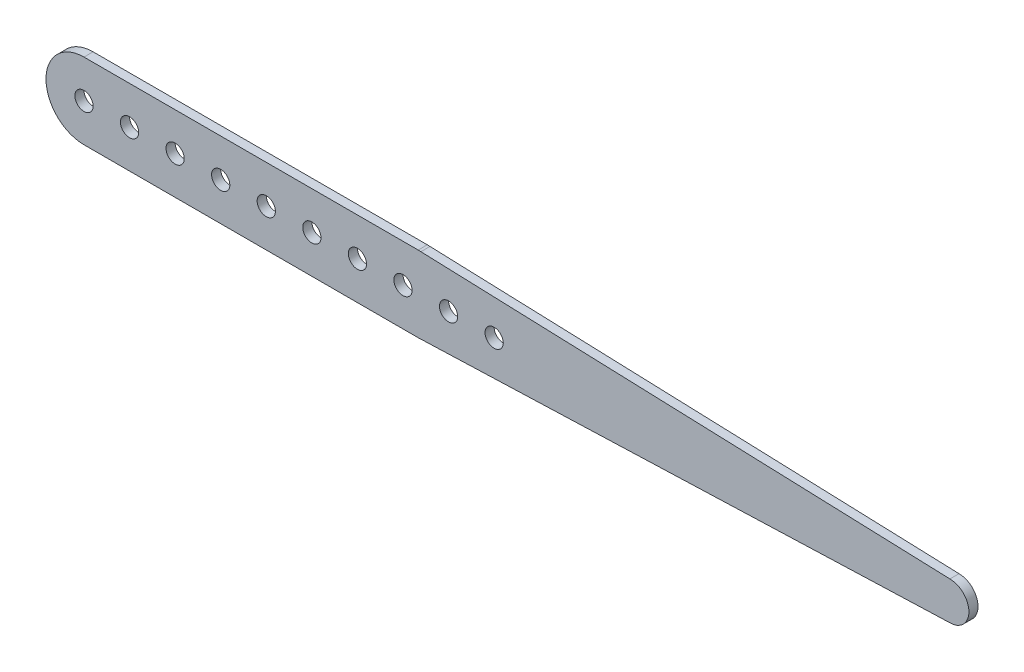
ISO-10303-21;
HEADER;
FILE_DESCRIPTION(('STEP AP214'),'2;1');
FILE_NAME('part.step','',(''),(''),'','','');
FILE_SCHEMA(('AUTOMOTIVE_DESIGN { 1 0 10303 214 1 1 1 1 }'));
ENDSEC;
DATA;
#1=APPLICATION_CONTEXT('core data for automotive mechanical design processes');
#2=APPLICATION_PROTOCOL_DEFINITION('international standard','automotive_design',2000,#1);
#3=PRODUCT_CONTEXT('',#1,'mechanical');
#4=PRODUCT('Part','Part','',(#3));
#5=PRODUCT_RELATED_PRODUCT_CATEGORY('part','',(#4));
#6=PRODUCT_DEFINITION_FORMATION('','',#4);
#7=PRODUCT_DEFINITION_CONTEXT('part definition',#1,'design');
#8=PRODUCT_DEFINITION('design','',#6,#7);
#9=PRODUCT_DEFINITION_SHAPE('','',#8);
#10=(LENGTH_UNIT() NAMED_UNIT(*) SI_UNIT(.MILLI.,.METRE.));
#11=(NAMED_UNIT(*) PLANE_ANGLE_UNIT() SI_UNIT($,.RADIAN.));
#12=(NAMED_UNIT(*) SI_UNIT($,.STERADIAN.) SOLID_ANGLE_UNIT());
#13=UNCERTAINTY_MEASURE_WITH_UNIT(LENGTH_MEASURE(1.E-05),#10,'distance_accuracy_value','');
#14=(GEOMETRIC_REPRESENTATION_CONTEXT(3) GLOBAL_UNCERTAINTY_ASSIGNED_CONTEXT((#13)) GLOBAL_UNIT_ASSIGNED_CONTEXT((#10,
#11,#12)) REPRESENTATION_CONTEXT('',''));
#15=CARTESIAN_POINT('',(0.,0.,0.));
#16=DIRECTION('',(0.,0.,1.));
#17=DIRECTION('',(1.,0.,0.));
#18=AXIS2_PLACEMENT_3D('',#15,#16,#17);
#19=CARTESIAN_POINT('',(0.,-12.5,3.));
#20=DIRECTION('',(0.,1.,0.));
#21=DIRECTION('',(-1.,0.,0.));
#22=AXIS2_PLACEMENT_3D('',#19,#20,#21);
#23=PLANE('',#22);
#24=DIRECTION('',(1.,0.,0.));
#25=VECTOR('',#24,1.);
#26=CARTESIAN_POINT('',(0.,-12.5,0.));
#27=LINE('',#26,#25);
#28=CARTESIAN_POINT('',(65.,-12.5,0.));
#29=VERTEX_POINT('',#28);
#30=CARTESIAN_POINT('',(175.,-12.5,0.));
#31=VERTEX_POINT('',#30);
#32=EDGE_CURVE('E238',#29,#31,#27,.T.);
#33=ORIENTED_EDGE('',*,*,#32,.T.);
#34=DIRECTION('',(0.,0.,-1.));
#35=VECTOR('',#34,1.);
#36=CARTESIAN_POINT('',(175.,-12.5,3.));
#37=LINE('',#36,#35);
#38=CARTESIAN_POINT('',(175.,-12.5,3.));
#39=VERTEX_POINT('',#38);
#40=EDGE_CURVE('E12',#39,#31,#37,.T.);
#41=ORIENTED_EDGE('',*,*,#40,.F.);
#42=DIRECTION('',(1.,0.,0.));
#43=VECTOR('',#42,1.);
#44=CARTESIAN_POINT('',(0.,-12.5,3.));
#45=LINE('',#44,#43);
#46=CARTESIAN_POINT('',(65.,-12.5,3.));
#47=VERTEX_POINT('',#46);
#48=EDGE_CURVE('E157',#47,#39,#45,.T.);
#49=ORIENTED_EDGE('',*,*,#48,.F.);
#50=DIRECTION('',(0.,0.,-1.));
#51=VECTOR('',#50,1.);
#52=CARTESIAN_POINT('',(65.,-12.5,3.));
#53=LINE('',#52,#51);
#54=EDGE_CURVE('E131',#47,#29,#53,.T.);
#55=ORIENTED_EDGE('',*,*,#54,.T.);
#56=EDGE_LOOP('',(#33,#41,#49,#55));
#57=FACE_BOUND('',#56,.T.);
#58=ADVANCED_FACE('F39',(#57),#23,.F.);
#59=CARTESIAN_POINT('',(175.,0.,3.));
#60=DIRECTION('',(0.,0.,-1.));
#61=DIRECTION('',(-1.,0.,0.));
#62=AXIS2_PLACEMENT_3D('',#59,#60,#61);
#63=CYLINDRICAL_SURFACE('',#62,12.5);
#64=CARTESIAN_POINT('',(175.,0.,0.));
#65=DIRECTION('',(0.,0.,1.));
#66=DIRECTION('',(1.,0.,0.));
#67=AXIS2_PLACEMENT_3D('',#64,#65,#66);
#68=CIRCLE('',#67,12.5);
#69=CARTESIAN_POINT('',(175.891719745223,-12.468152866242,0.));
#70=VERTEX_POINT('',#69);
#71=EDGE_CURVE('E241',#31,#70,#68,.T.);
#72=ORIENTED_EDGE('',*,*,#71,.T.);
#73=DIRECTION('',(0.,0.,-1.));
#74=VECTOR('',#73,1.);
#75=CARTESIAN_POINT('',(175.891719745223,-12.468152866242,3.));
#76=LINE('',#75,#74);
#77=CARTESIAN_POINT('',(175.891719745223,-12.468152866242,3.));
#78=VERTEX_POINT('',#77);
#79=EDGE_CURVE('E48',#78,#70,#76,.T.);
#80=ORIENTED_EDGE('',*,*,#79,.F.);
#81=CARTESIAN_POINT('',(175.,0.,3.));
#82=DIRECTION('',(0.,0.,1.));
#83=DIRECTION('',(1.,0.,0.));
#84=AXIS2_PLACEMENT_3D('',#81,#82,#83);
#85=CIRCLE('',#84,12.5);
#86=EDGE_CURVE('E99',#39,#78,#85,.T.);
#87=ORIENTED_EDGE('',*,*,#86,.F.);
#88=ORIENTED_EDGE('',*,*,#40,.T.);
#89=EDGE_LOOP('',(#72,#80,#87,#88));
#90=FACE_BOUND('',#89,.T.);
#91=ADVANCED_FACE('F266',(#90),#63,.T.);
#92=CARTESIAN_POINT('',(0.668789808917198,-18.7261146496815,3.));
#93=DIRECTION('',(0.0356915305124125,-0.999362854347549,0.));
#94=DIRECTION('',(0.99936285434755,0.0356915305124125,0.));
#95=AXIS2_PLACEMENT_3D('',#92,#93,#94);
#96=PLANE('',#95);
#97=DIRECTION('',(-0.99936285434755,-0.0356915305124125,0.));
#98=VECTOR('',#97,1.);
#99=CARTESIAN_POINT('',(0.668789808917198,-18.7261146496815,0.));
#100=LINE('',#99,#98);
#101=CARTESIAN_POINT('',(350.,-6.25,0.));
#102=VERTEX_POINT('',#101);
#103=EDGE_CURVE('E244',#102,#70,#100,.T.);
#104=ORIENTED_EDGE('',*,*,#103,.F.);
#105=DIRECTION('',(0.,0.,-1.));
#106=VECTOR('',#105,1.);
#107=CARTESIAN_POINT('',(350.,-6.25,3.));
#108=LINE('',#107,#106);
#109=CARTESIAN_POINT('',(350.,-6.25,3.));
#110=VERTEX_POINT('',#109);
#111=EDGE_CURVE('E261',#110,#102,#108,.T.);
#112=ORIENTED_EDGE('',*,*,#111,.F.);
#113=DIRECTION('',(-0.99936285434755,-0.0356915305124125,0.));
#114=VECTOR('',#113,1.);
#115=CARTESIAN_POINT('',(0.668789808917198,-18.7261146496815,3.));
#116=LINE('',#115,#114);
#117=EDGE_CURVE('E146',#110,#78,#116,.T.);
#118=ORIENTED_EDGE('',*,*,#117,.T.);
#119=ORIENTED_EDGE('',*,*,#79,.T.);
#120=EDGE_LOOP('',(#104,#112,#118,#119));
#121=FACE_BOUND('',#120,.T.);
#122=ADVANCED_FACE('F264',(#121),#96,.T.);
#123=CARTESIAN_POINT('',(350.,0.,3.));
#124=DIRECTION('',(0.,0.,-1.));
#125=DIRECTION('',(-1.,0.,0.));
#126=AXIS2_PLACEMENT_3D('',#123,#124,#125);
#127=CYLINDRICAL_SURFACE('',#126,6.25);
#128=CARTESIAN_POINT('',(350.,0.,0.));
#129=DIRECTION('',(0.,0.,1.));
#130=DIRECTION('',(1.,0.,0.));
#131=AXIS2_PLACEMENT_3D('',#128,#129,#130);
#132=CIRCLE('',#131,6.25);
#133=CARTESIAN_POINT('',(350.,6.25,0.));
#134=VERTEX_POINT('',#133);
#135=EDGE_CURVE('E247',#102,#134,#132,.T.);
#136=ORIENTED_EDGE('',*,*,#135,.T.);
#137=DIRECTION('',(0.,0.,-1.));
#138=VECTOR('',#137,1.);
#139=CARTESIAN_POINT('',(350.,6.25,3.));
#140=LINE('',#139,#138);
#141=CARTESIAN_POINT('',(350.,6.25,3.));
#142=VERTEX_POINT('',#141);
#143=EDGE_CURVE('E259',#142,#134,#140,.T.);
#144=ORIENTED_EDGE('',*,*,#143,.F.);
#145=CARTESIAN_POINT('',(350.,0.,3.));
#146=DIRECTION('',(0.,0.,1.));
#147=DIRECTION('',(1.,0.,0.));
#148=AXIS2_PLACEMENT_3D('',#145,#146,#147);
#149=CIRCLE('',#148,6.25);
#150=EDGE_CURVE('E143',#110,#142,#149,.T.);
#151=ORIENTED_EDGE('',*,*,#150,.F.);
#152=ORIENTED_EDGE('',*,*,#111,.T.);
#153=EDGE_LOOP('',(#136,#144,#151,#152));
#154=FACE_BOUND('',#153,.T.);
#155=ADVANCED_FACE('F275',(#154),#127,.T.);
#156=CARTESIAN_POINT('',(0.668789808917198,18.7261146496815,3.));
#157=DIRECTION('',(0.0356915305124125,0.999362854347549,0.));
#158=DIRECTION('',(-0.99936285434755,0.0356915305124125,0.));
#159=AXIS2_PLACEMENT_3D('',#156,#157,#158);
#160=PLANE('',#159);
#161=DIRECTION('',(0.99936285434755,-0.0356915305124125,0.));
#162=VECTOR('',#161,1.);
#163=CARTESIAN_POINT('',(0.668789808917198,18.7261146496815,0.));
#164=LINE('',#163,#162);
#165=CARTESIAN_POINT('',(175.891719745223,12.468152866242,0.));
#166=VERTEX_POINT('',#165);
#167=EDGE_CURVE('E250',#166,#134,#164,.T.);
#168=ORIENTED_EDGE('',*,*,#167,.F.);
#169=DIRECTION('',(0.,0.,-1.));
#170=VECTOR('',#169,1.);
#171=CARTESIAN_POINT('',(175.891719745223,12.468152866242,3.));
#172=LINE('',#171,#170);
#173=CARTESIAN_POINT('',(175.891719745223,12.468152866242,3.));
#174=VERTEX_POINT('',#173);
#175=EDGE_CURVE('E126',#174,#166,#172,.T.);
#176=ORIENTED_EDGE('',*,*,#175,.F.);
#177=DIRECTION('',(0.99936285434755,-0.0356915305124125,0.));
#178=VECTOR('',#177,1.);
#179=CARTESIAN_POINT('',(0.668789808917198,18.7261146496815,3.));
#180=LINE('',#179,#178);
#181=EDGE_CURVE('E119',#174,#142,#180,.T.);
#182=ORIENTED_EDGE('',*,*,#181,.T.);
#183=ORIENTED_EDGE('',*,*,#143,.T.);
#184=EDGE_LOOP('',(#168,#176,#182,#183));
#185=FACE_BOUND('',#184,.T.);
#186=ADVANCED_FACE('F280',(#185),#160,.T.);
#187=CARTESIAN_POINT('',(175.,0.,3.));
#188=DIRECTION('',(0.,0.,-1.));
#189=DIRECTION('',(-1.,0.,0.));
#190=AXIS2_PLACEMENT_3D('',#187,#188,#189);
#191=CYLINDRICAL_SURFACE('',#190,12.5);
#192=CARTESIAN_POINT('',(175.,0.,0.));
#193=DIRECTION('',(0.,0.,1.));
#194=DIRECTION('',(1.,0.,0.));
#195=AXIS2_PLACEMENT_3D('',#192,#193,#194);
#196=CIRCLE('',#195,12.5);
#197=CARTESIAN_POINT('',(175.,12.5,0.));
#198=VERTEX_POINT('',#197);
#199=EDGE_CURVE('E125',#166,#198,#196,.T.);
#200=ORIENTED_EDGE('',*,*,#199,.T.);
#201=DIRECTION('',(0.,0.,-1.));
#202=VECTOR('',#201,1.);
#203=CARTESIAN_POINT('',(175.,12.5,3.));
#204=LINE('',#203,#202);
#205=CARTESIAN_POINT('',(175.,12.5,3.));
#206=VERTEX_POINT('',#205);
#207=EDGE_CURVE('E122',#206,#198,#204,.T.);
#208=ORIENTED_EDGE('',*,*,#207,.F.);
#209=CARTESIAN_POINT('',(175.,0.,3.));
#210=DIRECTION('',(0.,0.,1.));
#211=DIRECTION('',(1.,0.,0.));
#212=AXIS2_PLACEMENT_3D('',#209,#210,#211);
#213=CIRCLE('',#212,12.5);
#214=EDGE_CURVE('E113',#174,#206,#213,.T.);
#215=ORIENTED_EDGE('',*,*,#214,.F.);
#216=ORIENTED_EDGE('',*,*,#175,.T.);
#217=EDGE_LOOP('',(#200,#208,#215,#216));
#218=FACE_BOUND('',#217,.T.);
#219=ADVANCED_FACE('F123',(#218),#191,.T.);
#220=CARTESIAN_POINT('',(0.,12.5,3.));
#221=DIRECTION('',(0.,-1.,0.));
#222=DIRECTION('',(1.,0.,0.));
#223=AXIS2_PLACEMENT_3D('',#220,#221,#222);
#224=PLANE('',#223);
#225=DIRECTION('',(-1.,0.,0.));
#226=VECTOR('',#225,1.);
#227=CARTESIAN_POINT('',(0.,12.5,0.));
#228=LINE('',#227,#226);
#229=CARTESIAN_POINT('',(65.,12.5,0.));
#230=VERTEX_POINT('',#229);
#231=EDGE_CURVE('E85',#198,#230,#228,.T.);
#232=ORIENTED_EDGE('',*,*,#231,.T.);
#233=DIRECTION('',(0.,0.,-1.));
#234=VECTOR('',#233,1.);
#235=CARTESIAN_POINT('',(65.,12.5,3.));
#236=LINE('',#235,#234);
#237=CARTESIAN_POINT('',(65.,12.5,3.));
#238=VERTEX_POINT('',#237);
#239=EDGE_CURVE('E127',#238,#230,#236,.T.);
#240=ORIENTED_EDGE('',*,*,#239,.F.);
#241=DIRECTION('',(-1.,0.,0.));
#242=VECTOR('',#241,1.);
#243=CARTESIAN_POINT('',(0.,12.5,3.));
#244=LINE('',#243,#242);
#245=EDGE_CURVE('E117',#206,#238,#244,.T.);
#246=ORIENTED_EDGE('',*,*,#245,.F.);
#247=ORIENTED_EDGE('',*,*,#207,.T.);
#248=EDGE_LOOP('',(#232,#240,#246,#247));
#249=FACE_BOUND('',#248,.T.);
#250=ADVANCED_FACE('F129',(#249),#224,.F.);
#251=CARTESIAN_POINT('',(65.,0.,3.));
#252=DIRECTION('',(0.,0.,-1.));
#253=DIRECTION('',(-1.,0.,0.));
#254=AXIS2_PLACEMENT_3D('',#251,#252,#253);
#255=CYLINDRICAL_SURFACE('',#254,2.99999999999999);
#256=CARTESIAN_POINT('',(65.,0.,3.));
#257=DIRECTION('',(0.,0.,1.));
#258=DIRECTION('',(1.,0.,0.));
#259=AXIS2_PLACEMENT_3D('',#256,#257,#258);
#260=CIRCLE('',#259,2.99999999999999);
#261=CARTESIAN_POINT('',(68.,0.,3.));
#262=VERTEX_POINT('',#261);
#263=EDGE_CURVE('E159',#262,#262,#260,.T.);
#264=ORIENTED_EDGE('',*,*,#263,.T.);
#265=EDGE_LOOP('',(#264));
#266=FACE_BOUND('',#265,.T.);
#267=CARTESIAN_POINT('',(65.,0.,0.));
#268=DIRECTION('',(0.,0.,1.));
#269=DIRECTION('',(1.,0.,0.));
#270=AXIS2_PLACEMENT_3D('',#267,#268,#269);
#271=CIRCLE('',#270,2.99999999999999);
#272=CARTESIAN_POINT('',(68.,0.,0.));
#273=VERTEX_POINT('',#272);
#274=EDGE_CURVE('E235',#273,#273,#271,.T.);
#275=ORIENTED_EDGE('',*,*,#274,.F.);
#276=EDGE_LOOP('',(#275));
#277=FACE_BOUND('',#276,.T.);
#278=ADVANCED_FACE('F297',(#266,#277),#255,.F.);
#279=CARTESIAN_POINT('',(80.,0.,3.));
#280=DIRECTION('',(0.,0.,-1.));
#281=DIRECTION('',(-1.,0.,0.));
#282=AXIS2_PLACEMENT_3D('',#279,#280,#281);
#283=CYLINDRICAL_SURFACE('',#282,2.99999999999999);
#284=CARTESIAN_POINT('',(80.,0.,3.));
#285=DIRECTION('',(0.,0.,1.));
#286=DIRECTION('',(1.,0.,0.));
#287=AXIS2_PLACEMENT_3D('',#284,#285,#286);
#288=CIRCLE('',#287,2.99999999999999);
#289=CARTESIAN_POINT('',(83.,0.,3.));
#290=VERTEX_POINT('',#289);
#291=EDGE_CURVE('E163',#290,#290,#288,.T.);
#292=ORIENTED_EDGE('',*,*,#291,.T.);
#293=EDGE_LOOP('',(#292));
#294=FACE_BOUND('',#293,.T.);
#295=CARTESIAN_POINT('',(80.,0.,0.));
#296=DIRECTION('',(0.,0.,1.));
#297=DIRECTION('',(1.,0.,0.));
#298=AXIS2_PLACEMENT_3D('',#295,#296,#297);
#299=CIRCLE('',#298,2.99999999999999);
#300=CARTESIAN_POINT('',(83.,0.,0.));
#301=VERTEX_POINT('',#300);
#302=EDGE_CURVE('E232',#301,#301,#299,.T.);
#303=ORIENTED_EDGE('',*,*,#302,.F.);
#304=EDGE_LOOP('',(#303));
#305=FACE_BOUND('',#304,.T.);
#306=ADVANCED_FACE('F300',(#294,#305),#283,.F.);
#307=CARTESIAN_POINT('',(95.,0.,3.));
#308=DIRECTION('',(0.,0.,-1.));
#309=DIRECTION('',(-1.,0.,0.));
#310=AXIS2_PLACEMENT_3D('',#307,#308,#309);
#311=CYLINDRICAL_SURFACE('',#310,2.99999999999999);
#312=CARTESIAN_POINT('',(95.,0.,3.));
#313=DIRECTION('',(0.,0.,1.));
#314=DIRECTION('',(1.,0.,0.));
#315=AXIS2_PLACEMENT_3D('',#312,#313,#314);
#316=CIRCLE('',#315,2.99999999999999);
#317=CARTESIAN_POINT('',(98.,0.,3.));
#318=VERTEX_POINT('',#317);
#319=EDGE_CURVE('E167',#318,#318,#316,.T.);
#320=ORIENTED_EDGE('',*,*,#319,.T.);
#321=EDGE_LOOP('',(#320));
#322=FACE_BOUND('',#321,.T.);
#323=CARTESIAN_POINT('',(95.,0.,0.));
#324=DIRECTION('',(0.,0.,1.));
#325=DIRECTION('',(1.,0.,0.));
#326=AXIS2_PLACEMENT_3D('',#323,#324,#325);
#327=CIRCLE('',#326,2.99999999999999);
#328=CARTESIAN_POINT('',(98.,0.,0.));
#329=VERTEX_POINT('',#328);
#330=EDGE_CURVE('E229',#329,#329,#327,.T.);
#331=ORIENTED_EDGE('',*,*,#330,.F.);
#332=EDGE_LOOP('',(#331));
#333=FACE_BOUND('',#332,.T.);
#334=ADVANCED_FACE('F304',(#322,#333),#311,.F.);
#335=CARTESIAN_POINT('',(110.,0.,3.));
#336=DIRECTION('',(0.,0.,-1.));
#337=DIRECTION('',(-1.,0.,0.));
#338=AXIS2_PLACEMENT_3D('',#335,#336,#337);
#339=CYLINDRICAL_SURFACE('',#338,2.99999999999999);
#340=CARTESIAN_POINT('',(110.,0.,3.));
#341=DIRECTION('',(0.,0.,1.));
#342=DIRECTION('',(1.,0.,0.));
#343=AXIS2_PLACEMENT_3D('',#340,#341,#342);
#344=CIRCLE('',#343,2.99999999999999);
#345=CARTESIAN_POINT('',(113.,0.,3.));
#346=VERTEX_POINT('',#345);
#347=EDGE_CURVE('E175',#346,#346,#344,.T.);
#348=ORIENTED_EDGE('',*,*,#347,.T.);
#349=EDGE_LOOP('',(#348));
#350=FACE_BOUND('',#349,.T.);
#351=CARTESIAN_POINT('',(110.,0.,0.));
#352=DIRECTION('',(0.,0.,1.));
#353=DIRECTION('',(1.,0.,0.));
#354=AXIS2_PLACEMENT_3D('',#351,#352,#353);
#355=CIRCLE('',#354,2.99999999999999);
#356=CARTESIAN_POINT('',(113.,0.,0.));
#357=VERTEX_POINT('',#356);
#358=EDGE_CURVE('E226',#357,#357,#355,.T.);
#359=ORIENTED_EDGE('',*,*,#358,.F.);
#360=EDGE_LOOP('',(#359));
#361=FACE_BOUND('',#360,.T.);
#362=ADVANCED_FACE('F308',(#350,#361),#339,.F.);
#363=CARTESIAN_POINT('',(125.,0.,3.));
#364=DIRECTION('',(0.,0.,-1.));
#365=DIRECTION('',(-1.,0.,0.));
#366=AXIS2_PLACEMENT_3D('',#363,#364,#365);
#367=CYLINDRICAL_SURFACE('',#366,2.99999999999999);
#368=CARTESIAN_POINT('',(125.,0.,3.));
#369=DIRECTION('',(0.,0.,1.));
#370=DIRECTION('',(1.,0.,0.));
#371=AXIS2_PLACEMENT_3D('',#368,#369,#370);
#372=CIRCLE('',#371,2.99999999999999);
#373=CARTESIAN_POINT('',(128.,0.,3.));
#374=VERTEX_POINT('',#373);
#375=EDGE_CURVE('E178',#374,#374,#372,.T.);
#376=ORIENTED_EDGE('',*,*,#375,.T.);
#377=EDGE_LOOP('',(#376));
#378=FACE_BOUND('',#377,.T.);
#379=CARTESIAN_POINT('',(125.,0.,0.));
#380=DIRECTION('',(0.,0.,1.));
#381=DIRECTION('',(1.,0.,0.));
#382=AXIS2_PLACEMENT_3D('',#379,#380,#381);
#383=CIRCLE('',#382,2.99999999999999);
#384=CARTESIAN_POINT('',(128.,0.,0.));
#385=VERTEX_POINT('',#384);
#386=EDGE_CURVE('E223',#385,#385,#383,.T.);
#387=ORIENTED_EDGE('',*,*,#386,.F.);
#388=EDGE_LOOP('',(#387));
#389=FACE_BOUND('',#388,.T.);
#390=ADVANCED_FACE('F312',(#378,#389),#367,.F.);
#391=CARTESIAN_POINT('',(140.,0.,3.));
#392=DIRECTION('',(0.,0.,-1.));
#393=DIRECTION('',(-1.,0.,0.));
#394=AXIS2_PLACEMENT_3D('',#391,#392,#393);
#395=CYLINDRICAL_SURFACE('',#394,2.99999999999999);
#396=CARTESIAN_POINT('',(140.,0.,3.));
#397=DIRECTION('',(0.,0.,1.));
#398=DIRECTION('',(1.,0.,0.));
#399=AXIS2_PLACEMENT_3D('',#396,#397,#398);
#400=CIRCLE('',#399,2.99999999999999);
#401=CARTESIAN_POINT('',(143.,0.,3.));
#402=VERTEX_POINT('',#401);
#403=EDGE_CURVE('E182',#402,#402,#400,.T.);
#404=ORIENTED_EDGE('',*,*,#403,.T.);
#405=EDGE_LOOP('',(#404));
#406=FACE_BOUND('',#405,.T.);
#407=CARTESIAN_POINT('',(140.,0.,0.));
#408=DIRECTION('',(0.,0.,1.));
#409=DIRECTION('',(1.,0.,0.));
#410=AXIS2_PLACEMENT_3D('',#407,#408,#409);
#411=CIRCLE('',#410,2.99999999999999);
#412=CARTESIAN_POINT('',(143.,0.,0.));
#413=VERTEX_POINT('',#412);
#414=EDGE_CURVE('E220',#413,#413,#411,.T.);
#415=ORIENTED_EDGE('',*,*,#414,.F.);
#416=EDGE_LOOP('',(#415));
#417=FACE_BOUND('',#416,.T.);
#418=ADVANCED_FACE('F316',(#406,#417),#395,.F.);
#419=CARTESIAN_POINT('',(155.,0.,3.));
#420=DIRECTION('',(0.,0.,-1.));
#421=DIRECTION('',(-1.,0.,0.));
#422=AXIS2_PLACEMENT_3D('',#419,#420,#421);
#423=CYLINDRICAL_SURFACE('',#422,2.99999999999999);
#424=CARTESIAN_POINT('',(155.,0.,3.));
#425=DIRECTION('',(0.,0.,1.));
#426=DIRECTION('',(1.,0.,0.));
#427=AXIS2_PLACEMENT_3D('',#424,#425,#426);
#428=CIRCLE('',#427,2.99999999999999);
#429=CARTESIAN_POINT('',(158.,0.,3.));
#430=VERTEX_POINT('',#429);
#431=EDGE_CURVE('E186',#430,#430,#428,.T.);
#432=ORIENTED_EDGE('',*,*,#431,.T.);
#433=EDGE_LOOP('',(#432));
#434=FACE_BOUND('',#433,.T.);
#435=CARTESIAN_POINT('',(155.,0.,0.));
#436=DIRECTION('',(0.,0.,1.));
#437=DIRECTION('',(1.,0.,0.));
#438=AXIS2_PLACEMENT_3D('',#435,#436,#437);
#439=CIRCLE('',#438,2.99999999999999);
#440=CARTESIAN_POINT('',(158.,0.,0.));
#441=VERTEX_POINT('',#440);
#442=EDGE_CURVE('E215',#441,#441,#439,.T.);
#443=ORIENTED_EDGE('',*,*,#442,.F.);
#444=EDGE_LOOP('',(#443));
#445=FACE_BOUND('',#444,.T.);
#446=ADVANCED_FACE('F320',(#434,#445),#423,.F.);
#447=CARTESIAN_POINT('',(170.,0.,3.));
#448=DIRECTION('',(0.,0.,-1.));
#449=DIRECTION('',(-1.,0.,0.));
#450=AXIS2_PLACEMENT_3D('',#447,#448,#449);
#451=CYLINDRICAL_SURFACE('',#450,2.99999999999999);
#452=CARTESIAN_POINT('',(170.,0.,3.));
#453=DIRECTION('',(0.,0.,1.));
#454=DIRECTION('',(1.,0.,0.));
#455=AXIS2_PLACEMENT_3D('',#452,#453,#454);
#456=CIRCLE('',#455,2.99999999999999);
#457=CARTESIAN_POINT('',(173.,0.,3.));
#458=VERTEX_POINT('',#457);
#459=EDGE_CURVE('E194',#458,#458,#456,.T.);
#460=ORIENTED_EDGE('',*,*,#459,.T.);
#461=EDGE_LOOP('',(#460));
#462=FACE_BOUND('',#461,.T.);
#463=CARTESIAN_POINT('',(170.,0.,0.));
#464=DIRECTION('',(0.,0.,1.));
#465=DIRECTION('',(1.,0.,0.));
#466=AXIS2_PLACEMENT_3D('',#463,#464,#465);
#467=CIRCLE('',#466,2.99999999999999);
#468=CARTESIAN_POINT('',(173.,0.,0.));
#469=VERTEX_POINT('',#468);
#470=EDGE_CURVE('E211',#469,#469,#467,.T.);
#471=ORIENTED_EDGE('',*,*,#470,.F.);
#472=EDGE_LOOP('',(#471));
#473=FACE_BOUND('',#472,.T.);
#474=ADVANCED_FACE('F323',(#462,#473),#451,.F.);
#475=CARTESIAN_POINT('',(185.,0.,3.));
#476=DIRECTION('',(0.,0.,-1.));
#477=DIRECTION('',(-1.,0.,0.));
#478=AXIS2_PLACEMENT_3D('',#475,#476,#477);
#479=CYLINDRICAL_SURFACE('',#478,2.99999999999999);
#480=CARTESIAN_POINT('',(185.,0.,3.));
#481=DIRECTION('',(0.,0.,1.));
#482=DIRECTION('',(1.,0.,0.));
#483=AXIS2_PLACEMENT_3D('',#480,#481,#482);
#484=CIRCLE('',#483,2.99999999999999);
#485=CARTESIAN_POINT('',(188.,0.,3.));
#486=VERTEX_POINT('',#485);
#487=EDGE_CURVE('E197',#486,#486,#484,.T.);
#488=ORIENTED_EDGE('',*,*,#487,.T.);
#489=EDGE_LOOP('',(#488));
#490=FACE_BOUND('',#489,.T.);
#491=CARTESIAN_POINT('',(185.,0.,0.));
#492=DIRECTION('',(0.,0.,1.));
#493=DIRECTION('',(1.,0.,0.));
#494=AXIS2_PLACEMENT_3D('',#491,#492,#493);
#495=CIRCLE('',#494,2.99999999999999);
#496=CARTESIAN_POINT('',(188.,0.,0.));
#497=VERTEX_POINT('',#496);
#498=EDGE_CURVE('E207',#497,#497,#495,.T.);
#499=ORIENTED_EDGE('',*,*,#498,.F.);
#500=EDGE_LOOP('',(#499));
#501=FACE_BOUND('',#500,.T.);
#502=ADVANCED_FACE('F41',(#490,#501),#479,.F.);
#503=CARTESIAN_POINT('',(65.,0.,3.));
#504=DIRECTION('',(0.,0.,-1.));
#505=DIRECTION('',(-1.,0.,0.));
#506=AXIS2_PLACEMENT_3D('',#503,#504,#505);
#507=CYLINDRICAL_SURFACE('',#506,12.5);
#508=CARTESIAN_POINT('',(65.,0.,0.));
#509=DIRECTION('',(0.,0.,1.));
#510=DIRECTION('',(1.,0.,0.));
#511=AXIS2_PLACEMENT_3D('',#508,#509,#510);
#512=CIRCLE('',#511,12.5);
#513=EDGE_CURVE('E91',#230,#29,#512,.T.);
#514=ORIENTED_EDGE('',*,*,#513,.T.);
#515=ORIENTED_EDGE('',*,*,#54,.F.);
#516=CARTESIAN_POINT('',(65.,0.,3.));
#517=DIRECTION('',(0.,0.,1.));
#518=DIRECTION('',(1.,0.,0.));
#519=AXIS2_PLACEMENT_3D('',#516,#517,#518);
#520=CIRCLE('',#519,12.5);
#521=EDGE_CURVE('E56',#238,#47,#520,.T.);
#522=ORIENTED_EDGE('',*,*,#521,.F.);
#523=ORIENTED_EDGE('',*,*,#239,.T.);
#524=EDGE_LOOP('',(#514,#515,#522,#523));
#525=FACE_BOUND('',#524,.T.);
#526=ADVANCED_FACE('F330',(#525),#507,.T.);
#527=CARTESIAN_POINT('',(0.,0.,3.));
#528=DIRECTION('',(0.,0.,1.));
#529=DIRECTION('',(1.,0.,0.));
#530=AXIS2_PLACEMENT_3D('',#527,#528,#529);
#531=PLANE('',#530);
#532=CARTESIAN_POINT('',(200.,0.,3.));
#533=DIRECTION('',(0.,0.,1.));
#534=DIRECTION('',(1.,0.,0.));
#535=AXIS2_PLACEMENT_3D('',#532,#533,#534);
#536=CIRCLE('',#535,2.99999999999999);
#537=CARTESIAN_POINT('',(203.,0.,3.));
#538=VERTEX_POINT('',#537);
#539=EDGE_CURVE('E201',#538,#538,#536,.T.);
#540=ORIENTED_EDGE('',*,*,#539,.F.);
#541=EDGE_LOOP('',(#540));
#542=FACE_BOUND('',#541,.T.);
#543=ORIENTED_EDGE('',*,*,#487,.F.);
#544=EDGE_LOOP('',(#543));
#545=FACE_BOUND('',#544,.T.);
#546=ORIENTED_EDGE('',*,*,#459,.F.);
#547=EDGE_LOOP('',(#546));
#548=FACE_BOUND('',#547,.T.);
#549=ORIENTED_EDGE('',*,*,#431,.F.);
#550=EDGE_LOOP('',(#549));
#551=FACE_BOUND('',#550,.T.);
#552=ORIENTED_EDGE('',*,*,#403,.F.);
#553=EDGE_LOOP('',(#552));
#554=FACE_BOUND('',#553,.T.);
#555=ORIENTED_EDGE('',*,*,#375,.F.);
#556=EDGE_LOOP('',(#555));
#557=FACE_BOUND('',#556,.T.);
#558=ORIENTED_EDGE('',*,*,#347,.F.);
#559=EDGE_LOOP('',(#558));
#560=FACE_BOUND('',#559,.T.);
#561=ORIENTED_EDGE('',*,*,#319,.F.);
#562=EDGE_LOOP('',(#561));
#563=FACE_BOUND('',#562,.T.);
#564=ORIENTED_EDGE('',*,*,#291,.F.);
#565=EDGE_LOOP('',(#564));
#566=FACE_BOUND('',#565,.T.);
#567=ORIENTED_EDGE('',*,*,#263,.F.);
#568=EDGE_LOOP('',(#567));
#569=FACE_BOUND('',#568,.T.);
#570=ORIENTED_EDGE('',*,*,#48,.T.);
#571=ORIENTED_EDGE('',*,*,#86,.T.);
#572=ORIENTED_EDGE('',*,*,#117,.F.);
#573=ORIENTED_EDGE('',*,*,#150,.T.);
#574=ORIENTED_EDGE('',*,*,#181,.F.);
#575=ORIENTED_EDGE('',*,*,#214,.T.);
#576=ORIENTED_EDGE('',*,*,#245,.T.);
#577=ORIENTED_EDGE('',*,*,#521,.T.);
#578=EDGE_LOOP('',(#570,#571,#572,#573,#574,#575,#576,#577));
#579=FACE_BOUND('',#578,.T.);
#580=ADVANCED_FACE('F115',(#542,#545,#548,#551,#554,#557,#560,#563,#566,#569,#579),#531,.T.);
#581=CARTESIAN_POINT('',(0.,0.,0.));
#582=DIRECTION('',(0.,0.,1.));
#583=DIRECTION('',(1.,0.,0.));
#584=AXIS2_PLACEMENT_3D('',#581,#582,#583);
#585=PLANE('',#584);
#586=CARTESIAN_POINT('',(200.,0.,0.));
#587=DIRECTION('',(0.,0.,1.));
#588=DIRECTION('',(1.,0.,0.));
#589=AXIS2_PLACEMENT_3D('',#586,#587,#588);
#590=CIRCLE('',#589,2.99999999999999);
#591=CARTESIAN_POINT('',(203.,0.,0.));
#592=VERTEX_POINT('',#591);
#593=EDGE_CURVE('E205',#592,#592,#590,.T.);
#594=ORIENTED_EDGE('',*,*,#593,.T.);
#595=EDGE_LOOP('',(#594));
#596=FACE_BOUND('',#595,.T.);
#597=ORIENTED_EDGE('',*,*,#498,.T.);
#598=EDGE_LOOP('',(#597));
#599=FACE_BOUND('',#598,.T.);
#600=ORIENTED_EDGE('',*,*,#470,.T.);
#601=EDGE_LOOP('',(#600));
#602=FACE_BOUND('',#601,.T.);
#603=ORIENTED_EDGE('',*,*,#442,.T.);
#604=EDGE_LOOP('',(#603));
#605=FACE_BOUND('',#604,.T.);
#606=ORIENTED_EDGE('',*,*,#414,.T.);
#607=EDGE_LOOP('',(#606));
#608=FACE_BOUND('',#607,.T.);
#609=ORIENTED_EDGE('',*,*,#386,.T.);
#610=EDGE_LOOP('',(#609));
#611=FACE_BOUND('',#610,.T.);
#612=ORIENTED_EDGE('',*,*,#358,.T.);
#613=EDGE_LOOP('',(#612));
#614=FACE_BOUND('',#613,.T.);
#615=ORIENTED_EDGE('',*,*,#330,.T.);
#616=EDGE_LOOP('',(#615));
#617=FACE_BOUND('',#616,.T.);
#618=ORIENTED_EDGE('',*,*,#302,.T.);
#619=EDGE_LOOP('',(#618));
#620=FACE_BOUND('',#619,.T.);
#621=ORIENTED_EDGE('',*,*,#274,.T.);
#622=EDGE_LOOP('',(#621));
#623=FACE_BOUND('',#622,.T.);
#624=ORIENTED_EDGE('',*,*,#32,.F.);
#625=ORIENTED_EDGE('',*,*,#513,.F.);
#626=ORIENTED_EDGE('',*,*,#231,.F.);
#627=ORIENTED_EDGE('',*,*,#199,.F.);
#628=ORIENTED_EDGE('',*,*,#167,.T.);
#629=ORIENTED_EDGE('',*,*,#135,.F.);
#630=ORIENTED_EDGE('',*,*,#103,.T.);
#631=ORIENTED_EDGE('',*,*,#71,.F.);
#632=EDGE_LOOP('',(#624,#625,#626,#627,#628,#629,#630,#631));
#633=FACE_BOUND('',#632,.T.);
#634=ADVANCED_FACE('F271',(#596,#599,#602,#605,#608,#611,#614,#617,#620,#623,#633),#585,.F.);
#635=CARTESIAN_POINT('',(200.,0.,0.));
#636=DIRECTION('',(0.,0.,1.));
#637=DIRECTION('',(1.,0.,0.));
#638=AXIS2_PLACEMENT_3D('',#635,#636,#637);
#639=CYLINDRICAL_SURFACE('',#638,2.99999999999999);
#640=ORIENTED_EDGE('',*,*,#593,.F.);
#641=EDGE_LOOP('',(#640));
#642=FACE_BOUND('',#641,.T.);
#643=ORIENTED_EDGE('',*,*,#539,.T.);
#644=EDGE_LOOP('',(#643));
#645=FACE_BOUND('',#644,.T.);
#646=ADVANCED_FACE('F338',(#642,#645),#639,.F.);
#647=CLOSED_SHELL('',(#58,#91,#122,#155,#186,#219,#250,#278,#306,#334,#362,#390,#418,#446,#474,
#502,#526,#580,#634,#646));
#648=MANIFOLD_SOLID_BREP('B2',#647);
#649=ADVANCED_BREP_SHAPE_REPRESENTATION('',(#18,#648),#14);
#650=SHAPE_DEFINITION_REPRESENTATION(#9,#649);
ENDSEC;
END-ISO-10303-21;
